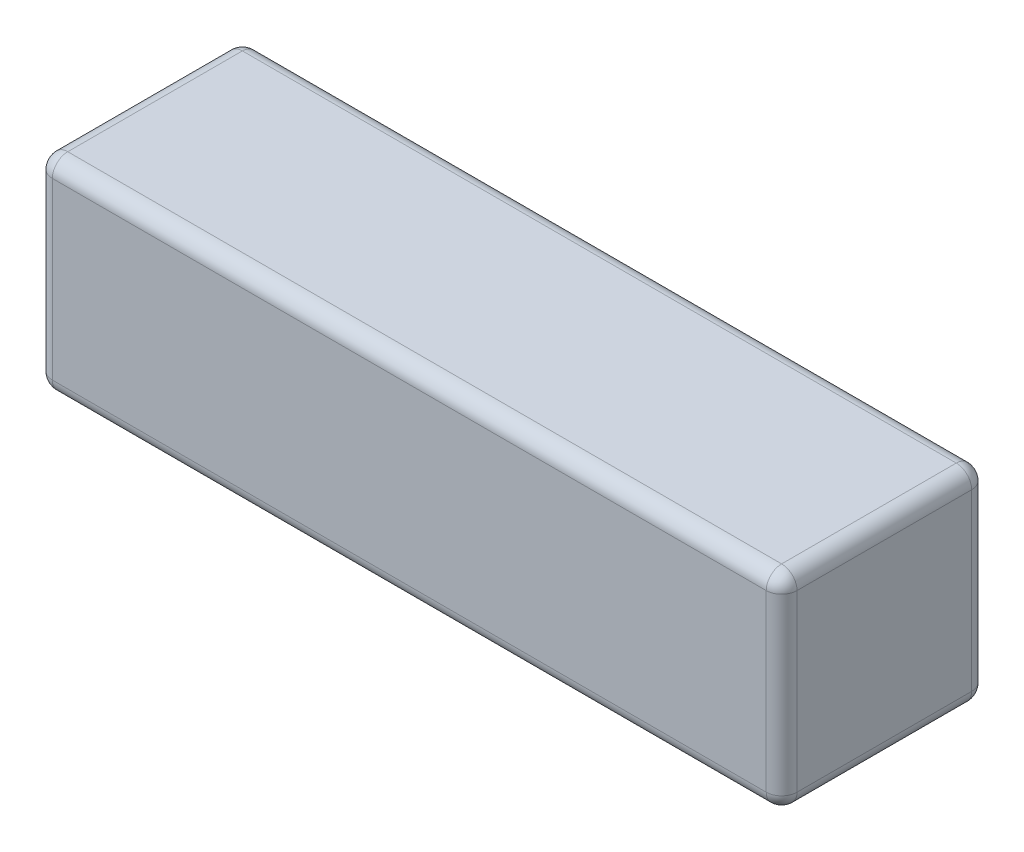
ISO-10303-21;
HEADER;
FILE_DESCRIPTION(('STEP AP214'),'2;1');
FILE_NAME('part.step','',(''),(''),'','','');
FILE_SCHEMA(('AUTOMOTIVE_DESIGN { 1 0 10303 214 1 1 1 1 }'));
ENDSEC;
DATA;
#1=APPLICATION_CONTEXT('core data for automotive mechanical design processes');
#2=APPLICATION_PROTOCOL_DEFINITION('international standard','automotive_design',2000,#1);
#3=PRODUCT_CONTEXT('',#1,'mechanical');
#4=PRODUCT('Part','Part','',(#3));
#5=PRODUCT_RELATED_PRODUCT_CATEGORY('part','',(#4));
#6=PRODUCT_DEFINITION_FORMATION('','',#4);
#7=PRODUCT_DEFINITION_CONTEXT('part definition',#1,'design');
#8=PRODUCT_DEFINITION('design','',#6,#7);
#9=PRODUCT_DEFINITION_SHAPE('','',#8);
#10=(LENGTH_UNIT() NAMED_UNIT(*) SI_UNIT(.MILLI.,.METRE.));
#11=(NAMED_UNIT(*) PLANE_ANGLE_UNIT() SI_UNIT($,.RADIAN.));
#12=(NAMED_UNIT(*) SI_UNIT($,.STERADIAN.) SOLID_ANGLE_UNIT());
#13=UNCERTAINTY_MEASURE_WITH_UNIT(LENGTH_MEASURE(1.E-05),#10,'distance_accuracy_value','');
#14=(GEOMETRIC_REPRESENTATION_CONTEXT(3) GLOBAL_UNCERTAINTY_ASSIGNED_CONTEXT((#13)) GLOBAL_UNIT_ASSIGNED_CONTEXT((#10,
#11,#12)) REPRESENTATION_CONTEXT('',''));
#15=CARTESIAN_POINT('',(0.,0.,0.));
#16=DIRECTION('',(0.,0.,1.));
#17=DIRECTION('',(1.,0.,0.));
#18=AXIS2_PLACEMENT_3D('',#15,#16,#17);
#19=CARTESIAN_POINT('',(-72.5,40.,20.));
#20=DIRECTION('',(1.,0.,0.));
#21=DIRECTION('',(0.,0.,-1.));
#22=AXIS2_PLACEMENT_3D('',#19,#20,#21);
#23=PLANE('',#22);
#24=DIRECTION('',(0.,-1.,0.));
#25=VECTOR('',#24,1.);
#26=CARTESIAN_POINT('',(-72.5,40.,17.));
#27=LINE('',#26,#25);
#28=CARTESIAN_POINT('',(-72.5,3.,17.));
#29=VERTEX_POINT('',#28);
#30=CARTESIAN_POINT('',(-72.5,37.,17.));
#31=VERTEX_POINT('',#30);
#32=EDGE_CURVE('E51',#29,#31,#27,.F.);
#33=ORIENTED_EDGE('',*,*,#32,.T.);
#34=DIRECTION('',(0.,0.,1.));
#35=VECTOR('',#34,1.);
#36=CARTESIAN_POINT('',(-72.5,37.,-17.));
#37=LINE('',#36,#35);
#38=CARTESIAN_POINT('',(-72.5,37.,-17.));
#39=VERTEX_POINT('',#38);
#40=EDGE_CURVE('E11',#31,#39,#37,.F.);
#41=ORIENTED_EDGE('',*,*,#40,.T.);
#42=DIRECTION('',(0.,-1.,0.));
#43=VECTOR('',#42,1.);
#44=CARTESIAN_POINT('',(-72.5,40.,-17.));
#45=LINE('',#44,#43);
#46=CARTESIAN_POINT('',(-72.5,3.,-17.));
#47=VERTEX_POINT('',#46);
#48=EDGE_CURVE('E144',#39,#47,#45,.T.);
#49=ORIENTED_EDGE('',*,*,#48,.T.);
#50=DIRECTION('',(0.,0.,1.));
#51=VECTOR('',#50,1.);
#52=CARTESIAN_POINT('',(-72.5,3.,20.));
#53=LINE('',#52,#51);
#54=EDGE_CURVE('E62',#47,#29,#53,.T.);
#55=ORIENTED_EDGE('',*,*,#54,.T.);
#56=EDGE_LOOP('',(#33,#41,#49,#55));
#57=FACE_BOUND('',#56,.T.);
#58=ADVANCED_FACE('F41',(#57),#23,.F.);
#59=CARTESIAN_POINT('',(72.5,40.,20.));
#60=DIRECTION('',(0.,0.,-1.));
#61=DIRECTION('',(-1.,0.,0.));
#62=AXIS2_PLACEMENT_3D('',#59,#60,#61);
#63=PLANE('',#62);
#64=DIRECTION('',(1.,0.,0.));
#65=VECTOR('',#64,1.);
#66=CARTESIAN_POINT('',(72.5,3.,20.));
#67=LINE('',#66,#65);
#68=CARTESIAN_POINT('',(-69.5,3.,20.));
#69=VERTEX_POINT('',#68);
#70=CARTESIAN_POINT('',(69.5,3.,20.));
#71=VERTEX_POINT('',#70);
#72=EDGE_CURVE('E294',#69,#71,#67,.T.);
#73=ORIENTED_EDGE('',*,*,#72,.T.);
#74=DIRECTION('',(0.,-1.,0.));
#75=VECTOR('',#74,1.);
#76=CARTESIAN_POINT('',(69.5,40.,20.));
#77=LINE('',#76,#75);
#78=CARTESIAN_POINT('',(69.5,37.,20.));
#79=VERTEX_POINT('',#78);
#80=EDGE_CURVE('E275',#71,#79,#77,.F.);
#81=ORIENTED_EDGE('',*,*,#80,.T.);
#82=DIRECTION('',(1.,0.,0.));
#83=VECTOR('',#82,1.);
#84=CARTESIAN_POINT('',(-72.5,37.,20.));
#85=LINE('',#84,#83);
#86=CARTESIAN_POINT('',(-69.5,37.,20.));
#87=VERTEX_POINT('',#86);
#88=EDGE_CURVE('E297',#79,#87,#85,.F.);
#89=ORIENTED_EDGE('',*,*,#88,.T.);
#90=DIRECTION('',(0.,-1.,0.));
#91=VECTOR('',#90,1.);
#92=CARTESIAN_POINT('',(-69.5,40.,20.));
#93=LINE('',#92,#91);
#94=EDGE_CURVE('E278',#87,#69,#93,.T.);
#95=ORIENTED_EDGE('',*,*,#94,.T.);
#96=EDGE_LOOP('',(#73,#81,#89,#95));
#97=FACE_BOUND('',#96,.T.);
#98=ADVANCED_FACE('F373',(#97),#63,.F.);
#99=CARTESIAN_POINT('',(72.5,40.,20.));
#100=DIRECTION('',(-1.,0.,0.));
#101=DIRECTION('',(0.,0.,1.));
#102=AXIS2_PLACEMENT_3D('',#99,#100,#101);
#103=PLANE('',#102);
#104=DIRECTION('',(0.,0.,-1.));
#105=VECTOR('',#104,1.);
#106=CARTESIAN_POINT('',(72.5,37.,17.));
#107=LINE('',#106,#105);
#108=CARTESIAN_POINT('',(72.5,37.,-17.));
#109=VERTEX_POINT('',#108);
#110=CARTESIAN_POINT('',(72.5,37.,17.));
#111=VERTEX_POINT('',#110);
#112=EDGE_CURVE('E284',#109,#111,#107,.F.);
#113=ORIENTED_EDGE('',*,*,#112,.T.);
#114=DIRECTION('',(0.,-1.,0.));
#115=VECTOR('',#114,1.);
#116=CARTESIAN_POINT('',(72.5,40.,17.));
#117=LINE('',#116,#115);
#118=CARTESIAN_POINT('',(72.5,3.,17.));
#119=VERTEX_POINT('',#118);
#120=EDGE_CURVE('E281',#111,#119,#117,.T.);
#121=ORIENTED_EDGE('',*,*,#120,.T.);
#122=DIRECTION('',(0.,0.,-1.));
#123=VECTOR('',#122,1.);
#124=CARTESIAN_POINT('',(72.5,3.,20.));
#125=LINE('',#124,#123);
#126=CARTESIAN_POINT('',(72.5,3.,-17.));
#127=VERTEX_POINT('',#126);
#128=EDGE_CURVE('E166',#119,#127,#125,.T.);
#129=ORIENTED_EDGE('',*,*,#128,.T.);
#130=DIRECTION('',(0.,-1.,0.));
#131=VECTOR('',#130,1.);
#132=CARTESIAN_POINT('',(72.5,40.,-17.));
#133=LINE('',#132,#131);
#134=EDGE_CURVE('E287',#127,#109,#133,.F.);
#135=ORIENTED_EDGE('',*,*,#134,.T.);
#136=EDGE_LOOP('',(#113,#121,#129,#135));
#137=FACE_BOUND('',#136,.T.);
#138=ADVANCED_FACE('F371',(#137),#103,.F.);
#139=CARTESIAN_POINT('',(72.5,40.,-20.));
#140=DIRECTION('',(0.,0.,1.));
#141=DIRECTION('',(1.,0.,0.));
#142=AXIS2_PLACEMENT_3D('',#139,#140,#141);
#143=PLANE('',#142);
#144=DIRECTION('',(-1.,0.,0.));
#145=VECTOR('',#144,1.);
#146=CARTESIAN_POINT('',(72.5,37.,-20.));
#147=LINE('',#146,#145);
#148=CARTESIAN_POINT('',(-69.5,37.,-20.));
#149=VERTEX_POINT('',#148);
#150=CARTESIAN_POINT('',(69.5,37.,-20.));
#151=VERTEX_POINT('',#150);
#152=EDGE_CURVE('E203',#149,#151,#147,.F.);
#153=ORIENTED_EDGE('',*,*,#152,.T.);
#154=DIRECTION('',(0.,-1.,0.));
#155=VECTOR('',#154,1.);
#156=CARTESIAN_POINT('',(69.5,40.,-20.));
#157=LINE('',#156,#155);
#158=CARTESIAN_POINT('',(69.5,3.,-20.));
#159=VERTEX_POINT('',#158);
#160=EDGE_CURVE('E250',#151,#159,#157,.T.);
#161=ORIENTED_EDGE('',*,*,#160,.T.);
#162=DIRECTION('',(-1.,0.,0.));
#163=VECTOR('',#162,1.);
#164=CARTESIAN_POINT('',(72.5,3.,-20.));
#165=LINE('',#164,#163);
#166=CARTESIAN_POINT('',(-69.5,3.,-20.));
#167=VERTEX_POINT('',#166);
#168=EDGE_CURVE('E157',#159,#167,#165,.T.);
#169=ORIENTED_EDGE('',*,*,#168,.T.);
#170=DIRECTION('',(0.,-1.,0.));
#171=VECTOR('',#170,1.);
#172=CARTESIAN_POINT('',(-69.5,40.,-20.));
#173=LINE('',#172,#171);
#174=EDGE_CURVE('E253',#167,#149,#173,.F.);
#175=ORIENTED_EDGE('',*,*,#174,.T.);
#176=EDGE_LOOP('',(#153,#161,#169,#175));
#177=FACE_BOUND('',#176,.T.);
#178=ADVANCED_FACE('F319',(#177),#143,.F.);
#179=CARTESIAN_POINT('',(0.,40.,0.));
#180=DIRECTION('',(0.,1.,0.));
#181=DIRECTION('',(0.,0.,1.));
#182=AXIS2_PLACEMENT_3D('',#179,#180,#181);
#183=PLANE('',#182);
#184=DIRECTION('',(1.,0.,0.));
#185=VECTOR('',#184,1.);
#186=CARTESIAN_POINT('',(72.5,40.,17.));
#187=LINE('',#186,#185);
#188=CARTESIAN_POINT('',(-69.5,40.,17.));
#189=VERTEX_POINT('',#188);
#190=CARTESIAN_POINT('',(69.5,40.,17.));
#191=VERTEX_POINT('',#190);
#192=EDGE_CURVE('E305',#189,#191,#187,.T.);
#193=ORIENTED_EDGE('',*,*,#192,.T.);
#194=DIRECTION('',(0.,0.,-1.));
#195=VECTOR('',#194,1.);
#196=CARTESIAN_POINT('',(69.5,40.,-17.));
#197=LINE('',#196,#195);
#198=CARTESIAN_POINT('',(69.5,40.,-17.));
#199=VERTEX_POINT('',#198);
#200=EDGE_CURVE('E263',#191,#199,#197,.T.);
#201=ORIENTED_EDGE('',*,*,#200,.T.);
#202=DIRECTION('',(-1.,0.,0.));
#203=VECTOR('',#202,1.);
#204=CARTESIAN_POINT('',(-72.5,40.,-17.));
#205=LINE('',#204,#203);
#206=CARTESIAN_POINT('',(-69.5,40.,-17.));
#207=VERTEX_POINT('',#206);
#208=EDGE_CURVE('E301',#199,#207,#205,.T.);
#209=ORIENTED_EDGE('',*,*,#208,.T.);
#210=DIRECTION('',(0.,0.,1.));
#211=VECTOR('',#210,1.);
#212=CARTESIAN_POINT('',(-69.5,40.,17.));
#213=LINE('',#212,#211);
#214=EDGE_CURVE('E266',#207,#189,#213,.T.);
#215=ORIENTED_EDGE('',*,*,#214,.T.);
#216=EDGE_LOOP('',(#193,#201,#209,#215));
#217=FACE_BOUND('',#216,.T.);
#218=ADVANCED_FACE('F358',(#217),#183,.T.);
#219=CARTESIAN_POINT('',(0.,0.,0.));
#220=DIRECTION('',(0.,1.,0.));
#221=DIRECTION('',(0.,0.,1.));
#222=AXIS2_PLACEMENT_3D('',#219,#220,#221);
#223=PLANE('',#222);
#224=DIRECTION('',(-1.,0.,0.));
#225=VECTOR('',#224,1.);
#226=CARTESIAN_POINT('',(0.,0.,-17.));
#227=LINE('',#226,#225);
#228=CARTESIAN_POINT('',(-69.5,0.,-17.));
#229=VERTEX_POINT('',#228);
#230=CARTESIAN_POINT('',(69.5,0.,-17.));
#231=VERTEX_POINT('',#230);
#232=EDGE_CURVE('E138',#229,#231,#227,.F.);
#233=ORIENTED_EDGE('',*,*,#232,.T.);
#234=DIRECTION('',(0.,0.,-1.));
#235=VECTOR('',#234,1.);
#236=CARTESIAN_POINT('',(69.5,0.,0.));
#237=LINE('',#236,#235);
#238=CARTESIAN_POINT('',(69.5,0.,17.));
#239=VERTEX_POINT('',#238);
#240=EDGE_CURVE('E132',#231,#239,#237,.F.);
#241=ORIENTED_EDGE('',*,*,#240,.T.);
#242=DIRECTION('',(1.,0.,0.));
#243=VECTOR('',#242,1.);
#244=CARTESIAN_POINT('',(0.,0.,17.));
#245=LINE('',#244,#243);
#246=CARTESIAN_POINT('',(-69.5,0.,17.));
#247=VERTEX_POINT('',#246);
#248=EDGE_CURVE('E135',#239,#247,#245,.F.);
#249=ORIENTED_EDGE('',*,*,#248,.T.);
#250=DIRECTION('',(0.,0.,1.));
#251=VECTOR('',#250,1.);
#252=CARTESIAN_POINT('',(-69.5,0.,0.));
#253=LINE('',#252,#251);
#254=EDGE_CURVE('E145',#247,#229,#253,.F.);
#255=ORIENTED_EDGE('',*,*,#254,.T.);
#256=EDGE_LOOP('',(#233,#241,#249,#255));
#257=FACE_BOUND('',#256,.T.);
#258=ADVANCED_FACE('F134',(#257),#223,.F.);
#259=CARTESIAN_POINT('',(72.5,3.,-17.));
#260=DIRECTION('',(-1.,0.,0.));
#261=DIRECTION('',(0.,0.,1.));
#262=AXIS2_PLACEMENT_3D('',#259,#260,#261);
#263=CYLINDRICAL_SURFACE('',#262,3.);
#264=ORIENTED_EDGE('',*,*,#168,.F.);
#265=CARTESIAN_POINT('',(69.5,3.,-17.));
#266=DIRECTION('',(-1.,0.,0.));
#267=DIRECTION('',(0.,0.,1.));
#268=AXIS2_PLACEMENT_3D('',#265,#266,#267);
#269=CIRCLE('',#268,3.);
#270=EDGE_CURVE('E244',#159,#231,#269,.T.);
#271=ORIENTED_EDGE('',*,*,#270,.T.);
#272=ORIENTED_EDGE('',*,*,#232,.F.);
#273=CARTESIAN_POINT('',(-69.5,3.,-17.));
#274=DIRECTION('',(-1.,0.,0.));
#275=DIRECTION('',(0.,0.,1.));
#276=AXIS2_PLACEMENT_3D('',#273,#274,#275);
#277=CIRCLE('',#276,3.);
#278=EDGE_CURVE('E247',#229,#167,#277,.F.);
#279=ORIENTED_EDGE('',*,*,#278,.T.);
#280=EDGE_LOOP('',(#264,#271,#272,#279));
#281=FACE_BOUND('',#280,.T.);
#282=ADVANCED_FACE('F338',(#281),#263,.T.);
#283=CARTESIAN_POINT('',(0.,37.,-17.));
#284=DIRECTION('',(1.,0.,0.));
#285=DIRECTION('',(0.,0.,-1.));
#286=AXIS2_PLACEMENT_3D('',#283,#284,#285);
#287=CYLINDRICAL_SURFACE('',#286,3.);
#288=ORIENTED_EDGE('',*,*,#208,.F.);
#289=CARTESIAN_POINT('',(69.5,37.,-17.));
#290=DIRECTION('',(1.,0.,0.));
#291=DIRECTION('',(0.,0.,-1.));
#292=AXIS2_PLACEMENT_3D('',#289,#290,#291);
#293=CIRCLE('',#292,3.);
#294=EDGE_CURVE('E256',#199,#151,#293,.F.);
#295=ORIENTED_EDGE('',*,*,#294,.T.);
#296=ORIENTED_EDGE('',*,*,#152,.F.);
#297=CARTESIAN_POINT('',(-69.5,37.,-17.));
#298=DIRECTION('',(1.,0.,0.));
#299=DIRECTION('',(0.,0.,-1.));
#300=AXIS2_PLACEMENT_3D('',#297,#298,#299);
#301=CIRCLE('',#300,3.);
#302=EDGE_CURVE('E259',#149,#207,#301,.T.);
#303=ORIENTED_EDGE('',*,*,#302,.T.);
#304=EDGE_LOOP('',(#288,#295,#296,#303));
#305=FACE_BOUND('',#304,.T.);
#306=ADVANCED_FACE('F357',(#305),#287,.T.);
#307=CARTESIAN_POINT('',(72.5,3.,17.));
#308=DIRECTION('',(1.,0.,0.));
#309=DIRECTION('',(0.,0.,-1.));
#310=AXIS2_PLACEMENT_3D('',#307,#308,#309);
#311=CYLINDRICAL_SURFACE('',#310,3.);
#312=ORIENTED_EDGE('',*,*,#248,.F.);
#313=CARTESIAN_POINT('',(69.5,3.,17.));
#314=DIRECTION('',(1.,0.,0.));
#315=DIRECTION('',(0.,0.,-1.));
#316=AXIS2_PLACEMENT_3D('',#313,#314,#315);
#317=CIRCLE('',#316,3.);
#318=EDGE_CURVE('E152',#239,#71,#317,.F.);
#319=ORIENTED_EDGE('',*,*,#318,.T.);
#320=ORIENTED_EDGE('',*,*,#72,.F.);
#321=CARTESIAN_POINT('',(-69.5,3.,17.));
#322=DIRECTION('',(1.,0.,0.));
#323=DIRECTION('',(0.,0.,-1.));
#324=AXIS2_PLACEMENT_3D('',#321,#322,#323);
#325=CIRCLE('',#324,3.);
#326=EDGE_CURVE('E155',#69,#247,#325,.T.);
#327=ORIENTED_EDGE('',*,*,#326,.T.);
#328=EDGE_LOOP('',(#312,#319,#320,#327));
#329=FACE_BOUND('',#328,.T.);
#330=ADVANCED_FACE('F150',(#329),#311,.T.);
#331=CARTESIAN_POINT('',(0.,37.,17.));
#332=DIRECTION('',(-1.,0.,0.));
#333=DIRECTION('',(0.,0.,1.));
#334=AXIS2_PLACEMENT_3D('',#331,#332,#333);
#335=CYLINDRICAL_SURFACE('',#334,3.);
#336=ORIENTED_EDGE('',*,*,#88,.F.);
#337=CARTESIAN_POINT('',(69.5,37.,17.));
#338=DIRECTION('',(-1.,0.,0.));
#339=DIRECTION('',(0.,0.,1.));
#340=AXIS2_PLACEMENT_3D('',#337,#338,#339);
#341=CIRCLE('',#340,3.);
#342=EDGE_CURVE('E269',#79,#191,#341,.T.);
#343=ORIENTED_EDGE('',*,*,#342,.T.);
#344=ORIENTED_EDGE('',*,*,#192,.F.);
#345=CARTESIAN_POINT('',(-69.5,37.,17.));
#346=DIRECTION('',(-1.,0.,0.));
#347=DIRECTION('',(0.,0.,1.));
#348=AXIS2_PLACEMENT_3D('',#345,#346,#347);
#349=CIRCLE('',#348,3.);
#350=EDGE_CURVE('E272',#189,#87,#349,.F.);
#351=ORIENTED_EDGE('',*,*,#350,.T.);
#352=EDGE_LOOP('',(#336,#343,#344,#351));
#353=FACE_BOUND('',#352,.T.);
#354=ADVANCED_FACE('F393',(#353),#335,.T.);
#355=CARTESIAN_POINT('',(69.5,37.,-17.));
#356=DIRECTION('',(-1.,0.,0.));
#357=DIRECTION('',(0.,0.,1.));
#358=AXIS2_PLACEMENT_3D('',#355,#356,#357);
#359=SPHERICAL_SURFACE('',#358,3.);
#360=CARTESIAN_POINT('',(69.5,37.,-17.));
#361=DIRECTION('',(0.,-1.,0.));
#362=DIRECTION('',(0.,0.,-1.));
#363=AXIS2_PLACEMENT_3D('',#360,#361,#362);
#364=CIRCLE('',#363,3.);
#365=EDGE_CURVE('E195',#151,#109,#364,.T.);
#366=ORIENTED_EDGE('',*,*,#365,.F.);
#367=ORIENTED_EDGE('',*,*,#294,.F.);
#368=CARTESIAN_POINT('',(69.5,37.,-17.));
#369=DIRECTION('',(0.,0.,1.));
#370=DIRECTION('',(1.,0.,0.));
#371=AXIS2_PLACEMENT_3D('',#368,#369,#370);
#372=CIRCLE('',#371,3.);
#373=EDGE_CURVE('E199',#109,#199,#372,.T.);
#374=ORIENTED_EDGE('',*,*,#373,.F.);
#375=EDGE_LOOP('',(#366,#367,#374));
#376=FACE_BOUND('',#375,.T.);
#377=ADVANCED_FACE('F328',(#376),#359,.T.);
#378=CARTESIAN_POINT('',(69.5,37.,0.));
#379=DIRECTION('',(0.,0.,1.));
#380=DIRECTION('',(1.,0.,0.));
#381=AXIS2_PLACEMENT_3D('',#378,#379,#380);
#382=CYLINDRICAL_SURFACE('',#381,3.);
#383=ORIENTED_EDGE('',*,*,#373,.T.);
#384=ORIENTED_EDGE('',*,*,#200,.F.);
#385=CARTESIAN_POINT('',(69.5,37.,17.));
#386=DIRECTION('',(0.,0.,1.));
#387=DIRECTION('',(1.,0.,0.));
#388=AXIS2_PLACEMENT_3D('',#385,#386,#387);
#389=CIRCLE('',#388,3.);
#390=EDGE_CURVE('E191',#111,#191,#389,.T.);
#391=ORIENTED_EDGE('',*,*,#390,.F.);
#392=ORIENTED_EDGE('',*,*,#112,.F.);
#393=EDGE_LOOP('',(#383,#384,#391,#392));
#394=FACE_BOUND('',#393,.T.);
#395=ADVANCED_FACE('F362',(#394),#382,.T.);
#396=CARTESIAN_POINT('',(69.5,40.,-17.));
#397=DIRECTION('',(0.,-1.,0.));
#398=DIRECTION('',(0.,0.,-1.));
#399=AXIS2_PLACEMENT_3D('',#396,#397,#398);
#400=CYLINDRICAL_SURFACE('',#399,3.);
#401=ORIENTED_EDGE('',*,*,#365,.T.);
#402=ORIENTED_EDGE('',*,*,#134,.F.);
#403=CARTESIAN_POINT('',(69.5,3.,-17.));
#404=DIRECTION('',(0.,-1.,0.));
#405=DIRECTION('',(0.,0.,-1.));
#406=AXIS2_PLACEMENT_3D('',#403,#404,#405);
#407=CIRCLE('',#406,3.);
#408=EDGE_CURVE('E187',#159,#127,#407,.T.);
#409=ORIENTED_EDGE('',*,*,#408,.F.);
#410=ORIENTED_EDGE('',*,*,#160,.F.);
#411=EDGE_LOOP('',(#401,#402,#409,#410));
#412=FACE_BOUND('',#411,.T.);
#413=ADVANCED_FACE('F333',(#412),#400,.T.);
#414=CARTESIAN_POINT('',(69.5,37.,17.));
#415=DIRECTION('',(-1.,0.,0.));
#416=DIRECTION('',(0.,0.,1.));
#417=AXIS2_PLACEMENT_3D('',#414,#415,#416);
#418=SPHERICAL_SURFACE('',#417,3.);
#419=ORIENTED_EDGE('',*,*,#390,.T.);
#420=ORIENTED_EDGE('',*,*,#342,.F.);
#421=CARTESIAN_POINT('',(69.5,37.,17.));
#422=DIRECTION('',(0.,-1.,0.));
#423=DIRECTION('',(0.,0.,-1.));
#424=AXIS2_PLACEMENT_3D('',#421,#422,#423);
#425=CIRCLE('',#424,3.);
#426=EDGE_CURVE('E183',#111,#79,#425,.T.);
#427=ORIENTED_EDGE('',*,*,#426,.F.);
#428=EDGE_LOOP('',(#419,#420,#427));
#429=FACE_BOUND('',#428,.T.);
#430=ADVANCED_FACE('F366',(#429),#418,.T.);
#431=CARTESIAN_POINT('',(69.5,3.,-17.));
#432=DIRECTION('',(-1.,0.,0.));
#433=DIRECTION('',(0.,0.,1.));
#434=AXIS2_PLACEMENT_3D('',#431,#432,#433);
#435=SPHERICAL_SURFACE('',#434,3.);
#436=ORIENTED_EDGE('',*,*,#270,.F.);
#437=ORIENTED_EDGE('',*,*,#408,.T.);
#438=CARTESIAN_POINT('',(69.5,3.,-17.));
#439=DIRECTION('',(0.,0.,1.));
#440=DIRECTION('',(1.,0.,0.));
#441=AXIS2_PLACEMENT_3D('',#438,#439,#440);
#442=CIRCLE('',#441,3.);
#443=EDGE_CURVE('E175',#231,#127,#442,.T.);
#444=ORIENTED_EDGE('',*,*,#443,.F.);
#445=EDGE_LOOP('',(#436,#437,#444));
#446=FACE_BOUND('',#445,.T.);
#447=ADVANCED_FACE('F336',(#446),#435,.T.);
#448=CARTESIAN_POINT('',(69.5,40.,17.));
#449=DIRECTION('',(0.,-1.,0.));
#450=DIRECTION('',(0.,0.,-1.));
#451=AXIS2_PLACEMENT_3D('',#448,#449,#450);
#452=CYLINDRICAL_SURFACE('',#451,3.);
#453=ORIENTED_EDGE('',*,*,#426,.T.);
#454=ORIENTED_EDGE('',*,*,#80,.F.);
#455=CARTESIAN_POINT('',(69.5,3.,17.));
#456=DIRECTION('',(0.,-1.,0.));
#457=DIRECTION('',(0.,0.,-1.));
#458=AXIS2_PLACEMENT_3D('',#455,#456,#457);
#459=CIRCLE('',#458,3.);
#460=EDGE_CURVE('E163',#119,#71,#459,.T.);
#461=ORIENTED_EDGE('',*,*,#460,.F.);
#462=ORIENTED_EDGE('',*,*,#120,.F.);
#463=EDGE_LOOP('',(#453,#454,#461,#462));
#464=FACE_BOUND('',#463,.T.);
#465=ADVANCED_FACE('F369',(#464),#452,.T.);
#466=CARTESIAN_POINT('',(69.5,3.,20.));
#467=DIRECTION('',(0.,0.,-1.));
#468=DIRECTION('',(-1.,0.,0.));
#469=AXIS2_PLACEMENT_3D('',#466,#467,#468);
#470=CYLINDRICAL_SURFACE('',#469,3.);
#471=ORIENTED_EDGE('',*,*,#443,.T.);
#472=ORIENTED_EDGE('',*,*,#128,.F.);
#473=CARTESIAN_POINT('',(69.5,3.,17.));
#474=DIRECTION('',(0.,0.,1.));
#475=DIRECTION('',(1.,0.,0.));
#476=AXIS2_PLACEMENT_3D('',#473,#474,#475);
#477=CIRCLE('',#476,3.);
#478=EDGE_CURVE('E161',#239,#119,#477,.T.);
#479=ORIENTED_EDGE('',*,*,#478,.F.);
#480=ORIENTED_EDGE('',*,*,#240,.F.);
#481=EDGE_LOOP('',(#471,#472,#479,#480));
#482=FACE_BOUND('',#481,.T.);
#483=ADVANCED_FACE('F169',(#482),#470,.T.);
#484=CARTESIAN_POINT('',(69.5,3.,17.));
#485=DIRECTION('',(-1.,0.,0.));
#486=DIRECTION('',(0.,0.,1.));
#487=AXIS2_PLACEMENT_3D('',#484,#485,#486);
#488=SPHERICAL_SURFACE('',#487,3.);
#489=ORIENTED_EDGE('',*,*,#460,.T.);
#490=ORIENTED_EDGE('',*,*,#318,.F.);
#491=ORIENTED_EDGE('',*,*,#478,.T.);
#492=EDGE_LOOP('',(#489,#490,#491));
#493=FACE_BOUND('',#492,.T.);
#494=ADVANCED_FACE('F160',(#493),#488,.T.);
#495=CARTESIAN_POINT('',(-69.5,3.,17.));
#496=DIRECTION('',(1.,0.,0.));
#497=DIRECTION('',(0.,0.,-1.));
#498=AXIS2_PLACEMENT_3D('',#495,#496,#497);
#499=SPHERICAL_SURFACE('',#498,3.);
#500=CARTESIAN_POINT('',(-69.5,3.,17.));
#501=DIRECTION('',(0.,0.,-1.));
#502=DIRECTION('',(-1.,0.,0.));
#503=AXIS2_PLACEMENT_3D('',#500,#501,#502);
#504=CIRCLE('',#503,3.);
#505=EDGE_CURVE('E178',#247,#29,#504,.T.);
#506=ORIENTED_EDGE('',*,*,#505,.F.);
#507=ORIENTED_EDGE('',*,*,#326,.F.);
#508=CARTESIAN_POINT('',(-69.5,3.,17.));
#509=DIRECTION('',(0.,1.,0.));
#510=DIRECTION('',(0.,0.,1.));
#511=AXIS2_PLACEMENT_3D('',#508,#509,#510);
#512=CIRCLE('',#511,3.);
#513=EDGE_CURVE('E45',#29,#69,#512,.T.);
#514=ORIENTED_EDGE('',*,*,#513,.F.);
#515=EDGE_LOOP('',(#506,#507,#514));
#516=FACE_BOUND('',#515,.T.);
#517=ADVANCED_FACE('F43',(#516),#499,.T.);
#518=CARTESIAN_POINT('',(-69.5,40.,17.));
#519=DIRECTION('',(0.,-1.,0.));
#520=DIRECTION('',(0.,0.,-1.));
#521=AXIS2_PLACEMENT_3D('',#518,#519,#520);
#522=CYLINDRICAL_SURFACE('',#521,3.);
#523=ORIENTED_EDGE('',*,*,#513,.T.);
#524=ORIENTED_EDGE('',*,*,#94,.F.);
#525=CARTESIAN_POINT('',(-69.5,37.,17.));
#526=DIRECTION('',(0.,1.,0.));
#527=DIRECTION('',(0.,0.,1.));
#528=AXIS2_PLACEMENT_3D('',#525,#526,#527);
#529=CIRCLE('',#528,3.);
#530=EDGE_CURVE('E222',#31,#87,#529,.T.);
#531=ORIENTED_EDGE('',*,*,#530,.F.);
#532=ORIENTED_EDGE('',*,*,#32,.F.);
#533=EDGE_LOOP('',(#523,#524,#531,#532));
#534=FACE_BOUND('',#533,.T.);
#535=ADVANCED_FACE('F234',(#534),#522,.T.);
#536=CARTESIAN_POINT('',(-69.5,3.,20.));
#537=DIRECTION('',(0.,0.,1.));
#538=DIRECTION('',(1.,0.,0.));
#539=AXIS2_PLACEMENT_3D('',#536,#537,#538);
#540=CYLINDRICAL_SURFACE('',#539,3.);
#541=ORIENTED_EDGE('',*,*,#505,.T.);
#542=ORIENTED_EDGE('',*,*,#54,.F.);
#543=CARTESIAN_POINT('',(-69.5,3.,-17.));
#544=DIRECTION('',(0.,0.,-1.));
#545=DIRECTION('',(-1.,0.,0.));
#546=AXIS2_PLACEMENT_3D('',#543,#544,#545);
#547=CIRCLE('',#546,3.);
#548=EDGE_CURVE('E218',#229,#47,#547,.T.);
#549=ORIENTED_EDGE('',*,*,#548,.F.);
#550=ORIENTED_EDGE('',*,*,#254,.F.);
#551=EDGE_LOOP('',(#541,#542,#549,#550));
#552=FACE_BOUND('',#551,.T.);
#553=ADVANCED_FACE('F229',(#552),#540,.T.);
#554=CARTESIAN_POINT('',(-69.5,37.,17.));
#555=DIRECTION('',(1.,0.,0.));
#556=DIRECTION('',(0.,0.,-1.));
#557=AXIS2_PLACEMENT_3D('',#554,#555,#556);
#558=SPHERICAL_SURFACE('',#557,3.);
#559=ORIENTED_EDGE('',*,*,#530,.T.);
#560=ORIENTED_EDGE('',*,*,#350,.F.);
#561=CARTESIAN_POINT('',(-69.5,37.,17.));
#562=DIRECTION('',(0.,0.,-1.));
#563=DIRECTION('',(-1.,0.,0.));
#564=AXIS2_PLACEMENT_3D('',#561,#562,#563);
#565=CIRCLE('',#564,3.);
#566=EDGE_CURVE('E214',#31,#189,#565,.T.);
#567=ORIENTED_EDGE('',*,*,#566,.F.);
#568=EDGE_LOOP('',(#559,#560,#567));
#569=FACE_BOUND('',#568,.T.);
#570=ADVANCED_FACE('F421',(#569),#558,.T.);
#571=CARTESIAN_POINT('',(-69.5,3.,-17.));
#572=DIRECTION('',(1.,0.,0.));
#573=DIRECTION('',(0.,0.,-1.));
#574=AXIS2_PLACEMENT_3D('',#571,#572,#573);
#575=SPHERICAL_SURFACE('',#574,3.);
#576=ORIENTED_EDGE('',*,*,#278,.F.);
#577=ORIENTED_EDGE('',*,*,#548,.T.);
#578=CARTESIAN_POINT('',(-69.5,3.,-17.));
#579=DIRECTION('',(0.,1.,0.));
#580=DIRECTION('',(0.,0.,1.));
#581=AXIS2_PLACEMENT_3D('',#578,#579,#580);
#582=CIRCLE('',#581,3.);
#583=EDGE_CURVE('E210',#167,#47,#582,.T.);
#584=ORIENTED_EDGE('',*,*,#583,.F.);
#585=EDGE_LOOP('',(#576,#577,#584));
#586=FACE_BOUND('',#585,.T.);
#587=ADVANCED_FACE('F342',(#586),#575,.T.);
#588=CARTESIAN_POINT('',(-69.5,37.,0.));
#589=DIRECTION('',(0.,0.,-1.));
#590=DIRECTION('',(-1.,0.,0.));
#591=AXIS2_PLACEMENT_3D('',#588,#589,#590);
#592=CYLINDRICAL_SURFACE('',#591,3.);
#593=ORIENTED_EDGE('',*,*,#566,.T.);
#594=ORIENTED_EDGE('',*,*,#214,.F.);
#595=CARTESIAN_POINT('',(-69.5,37.,-17.));
#596=DIRECTION('',(0.,0.,-1.));
#597=DIRECTION('',(-1.,0.,0.));
#598=AXIS2_PLACEMENT_3D('',#595,#596,#597);
#599=CIRCLE('',#598,3.);
#600=EDGE_CURVE('E207',#39,#207,#599,.T.);
#601=ORIENTED_EDGE('',*,*,#600,.F.);
#602=ORIENTED_EDGE('',*,*,#40,.F.);
#603=EDGE_LOOP('',(#593,#594,#601,#602));
#604=FACE_BOUND('',#603,.T.);
#605=ADVANCED_FACE('F353',(#604),#592,.T.);
#606=CARTESIAN_POINT('',(-69.5,40.,-17.));
#607=DIRECTION('',(0.,-1.,0.));
#608=DIRECTION('',(0.,0.,-1.));
#609=AXIS2_PLACEMENT_3D('',#606,#607,#608);
#610=CYLINDRICAL_SURFACE('',#609,3.);
#611=ORIENTED_EDGE('',*,*,#583,.T.);
#612=ORIENTED_EDGE('',*,*,#48,.F.);
#613=CARTESIAN_POINT('',(-69.5,37.,-17.));
#614=DIRECTION('',(0.,1.,0.));
#615=DIRECTION('',(0.,0.,1.));
#616=AXIS2_PLACEMENT_3D('',#613,#614,#615);
#617=CIRCLE('',#616,3.);
#618=EDGE_CURVE('E204',#149,#39,#617,.T.);
#619=ORIENTED_EDGE('',*,*,#618,.F.);
#620=ORIENTED_EDGE('',*,*,#174,.F.);
#621=EDGE_LOOP('',(#611,#612,#619,#620));
#622=FACE_BOUND('',#621,.T.);
#623=ADVANCED_FACE('F346',(#622),#610,.T.);
#624=CARTESIAN_POINT('',(-69.5,37.,-17.));
#625=DIRECTION('',(1.,0.,0.));
#626=DIRECTION('',(0.,0.,-1.));
#627=AXIS2_PLACEMENT_3D('',#624,#625,#626);
#628=SPHERICAL_SURFACE('',#627,3.);
#629=ORIENTED_EDGE('',*,*,#600,.T.);
#630=ORIENTED_EDGE('',*,*,#302,.F.);
#631=ORIENTED_EDGE('',*,*,#618,.T.);
#632=EDGE_LOOP('',(#629,#630,#631));
#633=FACE_BOUND('',#632,.T.);
#634=ADVANCED_FACE('F349',(#633),#628,.T.);
#635=CLOSED_SHELL('',(#58,#98,#138,#178,#218,#258,#282,#306,#330,#354,#377,#395,#413,#430,#447,
#465,#483,#494,#517,#535,#553,#570,#587,#605,#623,#634));
#636=MANIFOLD_SOLID_BREP('B2',#635);
#637=ADVANCED_BREP_SHAPE_REPRESENTATION('',(#18,#636),#14);
#638=SHAPE_DEFINITION_REPRESENTATION(#9,#637);
ENDSEC;
END-ISO-10303-21;
